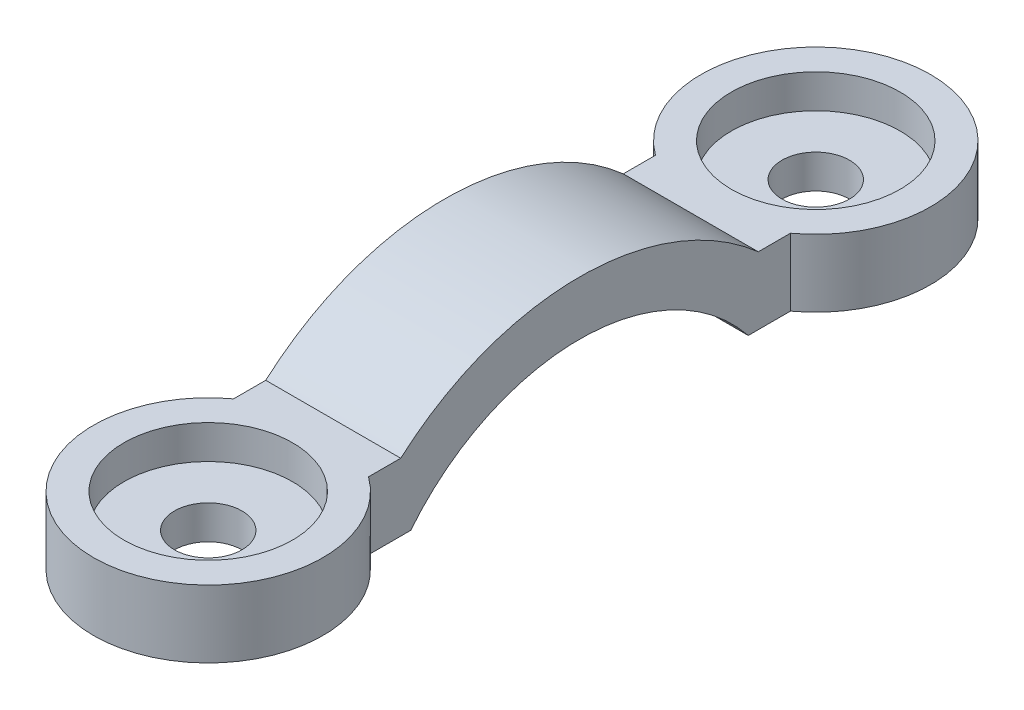
ISO-10303-21;
HEADER;
FILE_DESCRIPTION(('STEP AP214'),'2;1');
FILE_NAME('part.step','',(''),(''),'','','');
FILE_SCHEMA(('AUTOMOTIVE_DESIGN { 1 0 10303 214 1 1 1 1 }'));
ENDSEC;
DATA;
#1=APPLICATION_CONTEXT('core data for automotive mechanical design processes');
#2=APPLICATION_PROTOCOL_DEFINITION('international standard','automotive_design',2000,#1);
#3=PRODUCT_CONTEXT('',#1,'mechanical');
#4=PRODUCT('Part','Part','',(#3));
#5=PRODUCT_RELATED_PRODUCT_CATEGORY('part','',(#4));
#6=PRODUCT_DEFINITION_FORMATION('','',#4);
#7=PRODUCT_DEFINITION_CONTEXT('part definition',#1,'design');
#8=PRODUCT_DEFINITION('design','',#6,#7);
#9=PRODUCT_DEFINITION_SHAPE('','',#8);
#10=(LENGTH_UNIT() NAMED_UNIT(*) SI_UNIT(.MILLI.,.METRE.));
#11=(NAMED_UNIT(*) PLANE_ANGLE_UNIT() SI_UNIT($,.RADIAN.));
#12=(NAMED_UNIT(*) SI_UNIT($,.STERADIAN.) SOLID_ANGLE_UNIT());
#13=UNCERTAINTY_MEASURE_WITH_UNIT(LENGTH_MEASURE(1.E-05),#10,'distance_accuracy_value','');
#14=(GEOMETRIC_REPRESENTATION_CONTEXT(3) GLOBAL_UNCERTAINTY_ASSIGNED_CONTEXT((#13)) GLOBAL_UNIT_ASSIGNED_CONTEXT((#10,
#11,#12)) REPRESENTATION_CONTEXT('',''));
#15=CARTESIAN_POINT('',(0.,0.,0.));
#16=DIRECTION('',(0.,0.,1.));
#17=DIRECTION('',(1.,0.,0.));
#18=AXIS2_PLACEMENT_3D('',#15,#16,#17);
#19=CARTESIAN_POINT('',(5.,20.01,22.5028036855739));
#20=DIRECTION('',(0.,-1.,0.));
#21=DIRECTION('',(0.,0.,-1.));
#22=AXIS2_PLACEMENT_3D('',#19,#20,#21);
#23=CYLINDRICAL_SURFACE('',#22,2.5);
#24=CARTESIAN_POINT('',(5.,10.,22.5028036855739));
#25=DIRECTION('',(0.,-1.,0.));
#26=DIRECTION('',(0.,0.,-1.));
#27=AXIS2_PLACEMENT_3D('',#24,#25,#26);
#28=CIRCLE('',#27,2.5);
#29=CARTESIAN_POINT('',(5.,10.,20.0028036855739));
#30=VERTEX_POINT('',#29);
#31=EDGE_CURVE('E170',#30,#30,#28,.T.);
#32=ORIENTED_EDGE('',*,*,#31,.T.);
#33=EDGE_LOOP('',(#32));
#34=FACE_BOUND('',#33,.T.);
#35=CARTESIAN_POINT('',(5.,12.5,22.5028036855739));
#36=DIRECTION('',(0.,1.,0.));
#37=DIRECTION('',(0.,0.,1.));
#38=AXIS2_PLACEMENT_3D('',#35,#36,#37);
#39=CIRCLE('',#38,2.5);
#40=CARTESIAN_POINT('',(5.,12.5,25.0028036855739));
#41=VERTEX_POINT('',#40);
#42=EDGE_CURVE('E39',#41,#41,#39,.F.);
#43=ORIENTED_EDGE('',*,*,#42,.F.);
#44=EDGE_LOOP('',(#43));
#45=FACE_BOUND('',#44,.T.);
#46=ADVANCED_FACE('F35',(#34,#45),#23,.F.);
#47=CARTESIAN_POINT('',(5.,20.01,-22.5028036855739));
#48=DIRECTION('',(0.,-1.,0.));
#49=DIRECTION('',(0.,0.,-1.));
#50=AXIS2_PLACEMENT_3D('',#47,#48,#49);
#51=CYLINDRICAL_SURFACE('',#50,2.5);
#52=CARTESIAN_POINT('',(5.,10.,-22.5028036855739));
#53=DIRECTION('',(0.,-1.,0.));
#54=DIRECTION('',(0.,0.,1.));
#55=AXIS2_PLACEMENT_3D('',#52,#53,#54);
#56=CIRCLE('',#55,2.5);
#57=CARTESIAN_POINT('',(5.,10.,-20.0028036855739));
#58=VERTEX_POINT('',#57);
#59=EDGE_CURVE('E167',#58,#58,#56,.T.);
#60=ORIENTED_EDGE('',*,*,#59,.T.);
#61=EDGE_LOOP('',(#60));
#62=FACE_BOUND('',#61,.T.);
#63=CARTESIAN_POINT('',(5.,12.5,-22.5028036855739));
#64=DIRECTION('',(0.,1.,0.));
#65=DIRECTION('',(0.,0.,1.));
#66=AXIS2_PLACEMENT_3D('',#63,#64,#65);
#67=CIRCLE('',#66,2.5);
#68=CARTESIAN_POINT('',(5.,12.5,-20.0028036855739));
#69=VERTEX_POINT('',#68);
#70=EDGE_CURVE('E142',#69,#69,#67,.F.);
#71=ORIENTED_EDGE('',*,*,#70,.F.);
#72=EDGE_LOOP('',(#71));
#73=FACE_BOUND('',#72,.T.);
#74=ADVANCED_FACE('F219',(#62,#73),#51,.F.);
#75=CARTESIAN_POINT('',(10.,15.,0.));
#76=DIRECTION('',(0.,-1.,0.));
#77=DIRECTION('',(0.,0.,-1.));
#78=AXIS2_PLACEMENT_3D('',#75,#76,#77);
#79=PLANE('',#78);
#80=CARTESIAN_POINT('',(5.,15.,-22.5028036855739));
#81=DIRECTION('',(0.,1.,0.));
#82=DIRECTION('',(0.,0.,1.));
#83=AXIS2_PLACEMENT_3D('',#80,#81,#82);
#84=CIRCLE('',#83,6.25);
#85=CARTESIAN_POINT('',(5.,15.,-16.2528036855739));
#86=VERTEX_POINT('',#85);
#87=EDGE_CURVE('E152',#86,#86,#84,.T.);
#88=ORIENTED_EDGE('',*,*,#87,.F.);
#89=EDGE_LOOP('',(#88));
#90=FACE_BOUND('',#89,.T.);
#91=DIRECTION('',(0.,0.,1.));
#92=VECTOR('',#91,1.);
#93=CARTESIAN_POINT('',(10.,15.,0.));
#94=LINE('',#93,#92);
#95=CARTESIAN_POINT('',(10.,15.,-15.6289401431401));
#96=VERTEX_POINT('',#95);
#97=CARTESIAN_POINT('',(10.,15.,-13.2438702802466));
#98=VERTEX_POINT('',#97);
#99=EDGE_CURVE('E125',#96,#98,#94,.T.);
#100=ORIENTED_EDGE('',*,*,#99,.F.);
#101=CARTESIAN_POINT('',(5.,15.,-22.5028036855739));
#102=DIRECTION('',(0.,1.,0.));
#103=DIRECTION('',(0.,0.,1.));
#104=AXIS2_PLACEMENT_3D('',#101,#102,#103);
#105=CIRCLE('',#104,8.5);
#106=CARTESIAN_POINT('',(0.,15.,-15.6289401431401));
#107=VERTEX_POINT('',#106);
#108=EDGE_CURVE('E109',#96,#107,#105,.T.);
#109=ORIENTED_EDGE('',*,*,#108,.T.);
#110=DIRECTION('',(0.,0.,1.));
#111=VECTOR('',#110,1.);
#112=CARTESIAN_POINT('',(0.,15.,0.));
#113=LINE('',#112,#111);
#114=CARTESIAN_POINT('',(0.,15.,-13.2438702802466));
#115=VERTEX_POINT('',#114);
#116=EDGE_CURVE('E119',#107,#115,#113,.T.);
#117=ORIENTED_EDGE('',*,*,#116,.T.);
#118=DIRECTION('',(-1.,0.,0.));
#119=VECTOR('',#118,1.);
#120=CARTESIAN_POINT('',(10.,15.,-13.2438702802466));
#121=LINE('',#120,#119);
#122=EDGE_CURVE('E120',#98,#115,#121,.T.);
#123=ORIENTED_EDGE('',*,*,#122,.F.);
#124=EDGE_LOOP('',(#100,#109,#117,#123));
#125=FACE_BOUND('',#124,.T.);
#126=ADVANCED_FACE('F37',(#90,#125),#79,.F.);
#127=CARTESIAN_POINT('',(10.,0.,0.));
#128=DIRECTION('',(-1.,0.,0.));
#129=DIRECTION('',(0.,0.,1.));
#130=AXIS2_PLACEMENT_3D('',#127,#128,#129);
#131=CYLINDRICAL_SURFACE('',#130,20.01);
#132=CARTESIAN_POINT('',(0.,0.,0.));
#133=DIRECTION('',(1.,0.,0.));
#134=DIRECTION('',(0.,0.,-1.));
#135=AXIS2_PLACEMENT_3D('',#132,#133,#134);
#136=CIRCLE('',#135,20.01);
#137=CARTESIAN_POINT('',(0.,15.,13.2438702802466));
#138=VERTEX_POINT('',#137);
#139=EDGE_CURVE('E182',#115,#138,#136,.T.);
#140=ORIENTED_EDGE('',*,*,#139,.T.);
#141=DIRECTION('',(-1.,0.,0.));
#142=VECTOR('',#141,1.);
#143=CARTESIAN_POINT('',(10.,15.,13.2438702802466));
#144=LINE('',#143,#142);
#145=CARTESIAN_POINT('',(10.,15.,13.2438702802466));
#146=VERTEX_POINT('',#145);
#147=EDGE_CURVE('E138',#146,#138,#144,.T.);
#148=ORIENTED_EDGE('',*,*,#147,.F.);
#149=CARTESIAN_POINT('',(10.,0.,0.));
#150=DIRECTION('',(1.,0.,0.));
#151=DIRECTION('',(0.,0.,-1.));
#152=AXIS2_PLACEMENT_3D('',#149,#150,#151);
#153=CIRCLE('',#152,20.01);
#154=EDGE_CURVE('E128',#98,#146,#153,.T.);
#155=ORIENTED_EDGE('',*,*,#154,.F.);
#156=ORIENTED_EDGE('',*,*,#122,.T.);
#157=EDGE_LOOP('',(#140,#148,#155,#156));
#158=FACE_BOUND('',#157,.T.);
#159=ADVANCED_FACE('F205',(#158),#131,.T.);
#160=CARTESIAN_POINT('',(10.,15.,0.));
#161=DIRECTION('',(0.,1.,0.));
#162=DIRECTION('',(0.,0.,1.));
#163=AXIS2_PLACEMENT_3D('',#160,#161,#162);
#164=PLANE('',#163);
#165=CARTESIAN_POINT('',(5.,15.,22.5028036855739));
#166=DIRECTION('',(0.,1.,0.));
#167=DIRECTION('',(0.,0.,1.));
#168=AXIS2_PLACEMENT_3D('',#165,#166,#167);
#169=CIRCLE('',#168,6.25);
#170=CARTESIAN_POINT('',(5.,15.,28.7528036855739));
#171=VERTEX_POINT('',#170);
#172=EDGE_CURVE('E159',#171,#171,#169,.T.);
#173=ORIENTED_EDGE('',*,*,#172,.F.);
#174=EDGE_LOOP('',(#173));
#175=FACE_BOUND('',#174,.T.);
#176=DIRECTION('',(0.,0.,-1.));
#177=VECTOR('',#176,1.);
#178=CARTESIAN_POINT('',(0.,15.,0.));
#179=LINE('',#178,#177);
#180=CARTESIAN_POINT('',(0.,15.,15.6289401431401));
#181=VERTEX_POINT('',#180);
#182=EDGE_CURVE('E185',#181,#138,#179,.T.);
#183=ORIENTED_EDGE('',*,*,#182,.F.);
#184=CARTESIAN_POINT('',(5.,15.,22.5028036855739));
#185=DIRECTION('',(0.,1.,0.));
#186=DIRECTION('',(0.,0.,1.));
#187=AXIS2_PLACEMENT_3D('',#184,#185,#186);
#188=CIRCLE('',#187,8.5);
#189=CARTESIAN_POINT('',(10.,15.,15.6289401431401));
#190=VERTEX_POINT('',#189);
#191=EDGE_CURVE('E144',#181,#190,#188,.T.);
#192=ORIENTED_EDGE('',*,*,#191,.T.);
#193=DIRECTION('',(0.,0.,-1.));
#194=VECTOR('',#193,1.);
#195=CARTESIAN_POINT('',(10.,15.,0.));
#196=LINE('',#195,#194);
#197=EDGE_CURVE('E57',#190,#146,#196,.T.);
#198=ORIENTED_EDGE('',*,*,#197,.T.);
#199=ORIENTED_EDGE('',*,*,#147,.T.);
#200=EDGE_LOOP('',(#183,#192,#198,#199));
#201=FACE_BOUND('',#200,.T.);
#202=ADVANCED_FACE('F208',(#175,#201),#164,.T.);
#203=CARTESIAN_POINT('',(10.,10.,0.));
#204=DIRECTION('',(0.,-1.,0.));
#205=DIRECTION('',(0.,0.,-1.));
#206=AXIS2_PLACEMENT_3D('',#203,#204,#205);
#207=PLANE('',#206);
#208=DIRECTION('',(0.,0.,1.));
#209=VECTOR('',#208,1.);
#210=CARTESIAN_POINT('',(10.,10.,0.));
#211=LINE('',#210,#209);
#212=CARTESIAN_POINT('',(10.,10.,12.5028036855739));
#213=VERTEX_POINT('',#212);
#214=CARTESIAN_POINT('',(10.,10.,15.6289401431401));
#215=VERTEX_POINT('',#214);
#216=EDGE_CURVE('E175',#213,#215,#211,.T.);
#217=ORIENTED_EDGE('',*,*,#216,.T.);
#218=CARTESIAN_POINT('',(5.,10.,22.5028036855739));
#219=DIRECTION('',(0.,1.,0.));
#220=DIRECTION('',(0.,0.,1.));
#221=AXIS2_PLACEMENT_3D('',#218,#219,#220);
#222=CIRCLE('',#221,8.5);
#223=CARTESIAN_POINT('',(0.,10.,15.6289401431401));
#224=VERTEX_POINT('',#223);
#225=EDGE_CURVE('E149',#215,#224,#222,.F.);
#226=ORIENTED_EDGE('',*,*,#225,.T.);
#227=DIRECTION('',(0.,0.,1.));
#228=VECTOR('',#227,1.);
#229=CARTESIAN_POINT('',(0.,10.,0.));
#230=LINE('',#229,#228);
#231=CARTESIAN_POINT('',(0.,10.,12.5028036855739));
#232=VERTEX_POINT('',#231);
#233=EDGE_CURVE('E130',#232,#224,#230,.T.);
#234=ORIENTED_EDGE('',*,*,#233,.F.);
#235=DIRECTION('',(-1.,0.,0.));
#236=VECTOR('',#235,1.);
#237=CARTESIAN_POINT('',(10.,10.,12.5028036855739));
#238=LINE('',#237,#236);
#239=EDGE_CURVE('E135',#213,#232,#238,.T.);
#240=ORIENTED_EDGE('',*,*,#239,.F.);
#241=EDGE_LOOP('',(#217,#226,#234,#240));
#242=FACE_BOUND('',#241,.T.);
#243=ORIENTED_EDGE('',*,*,#31,.F.);
#244=EDGE_LOOP('',(#243));
#245=FACE_BOUND('',#244,.T.);
#246=ADVANCED_FACE('F194',(#242,#245),#207,.T.);
#247=CARTESIAN_POINT('',(10.,0.,0.));
#248=DIRECTION('',(-1.,0.,0.));
#249=DIRECTION('',(0.,0.,1.));
#250=AXIS2_PLACEMENT_3D('',#247,#248,#249);
#251=CYLINDRICAL_SURFACE('',#250,16.01);
#252=CARTESIAN_POINT('',(0.,0.,0.));
#253=DIRECTION('',(1.,0.,0.));
#254=DIRECTION('',(0.,0.,-1.));
#255=AXIS2_PLACEMENT_3D('',#252,#253,#254);
#256=CIRCLE('',#255,16.01);
#257=CARTESIAN_POINT('',(0.,10.,-12.5028036855739));
#258=VERTEX_POINT('',#257);
#259=EDGE_CURVE('E126',#258,#232,#256,.T.);
#260=ORIENTED_EDGE('',*,*,#259,.F.);
#261=DIRECTION('',(-1.,0.,0.));
#262=VECTOR('',#261,1.);
#263=CARTESIAN_POINT('',(10.,10.,-12.5028036855739));
#264=LINE('',#263,#262);
#265=CARTESIAN_POINT('',(10.,10.,-12.5028036855739));
#266=VERTEX_POINT('',#265);
#267=EDGE_CURVE('E124',#266,#258,#264,.T.);
#268=ORIENTED_EDGE('',*,*,#267,.F.);
#269=CARTESIAN_POINT('',(10.,0.,0.));
#270=DIRECTION('',(1.,0.,0.));
#271=DIRECTION('',(0.,0.,-1.));
#272=AXIS2_PLACEMENT_3D('',#269,#270,#271);
#273=CIRCLE('',#272,16.01);
#274=EDGE_CURVE('E177',#266,#213,#273,.T.);
#275=ORIENTED_EDGE('',*,*,#274,.T.);
#276=ORIENTED_EDGE('',*,*,#239,.T.);
#277=EDGE_LOOP('',(#260,#268,#275,#276));
#278=FACE_BOUND('',#277,.T.);
#279=ADVANCED_FACE('F199',(#278),#251,.F.);
#280=CARTESIAN_POINT('',(10.,10.,0.));
#281=DIRECTION('',(0.,1.,0.));
#282=DIRECTION('',(0.,0.,1.));
#283=AXIS2_PLACEMENT_3D('',#280,#281,#282);
#284=PLANE('',#283);
#285=DIRECTION('',(0.,0.,-1.));
#286=VECTOR('',#285,1.);
#287=CARTESIAN_POINT('',(0.,10.,0.));
#288=LINE('',#287,#286);
#289=CARTESIAN_POINT('',(0.,10.,-15.6289401431401));
#290=VERTEX_POINT('',#289);
#291=EDGE_CURVE('E116',#258,#290,#288,.T.);
#292=ORIENTED_EDGE('',*,*,#291,.T.);
#293=CARTESIAN_POINT('',(5.,10.,-22.5028036855739));
#294=DIRECTION('',(0.,1.,0.));
#295=DIRECTION('',(0.,0.,1.));
#296=AXIS2_PLACEMENT_3D('',#293,#294,#295);
#297=CIRCLE('',#296,8.5);
#298=CARTESIAN_POINT('',(10.,10.,-15.6289401431401));
#299=VERTEX_POINT('',#298);
#300=EDGE_CURVE('E99',#290,#299,#297,.F.);
#301=ORIENTED_EDGE('',*,*,#300,.T.);
#302=DIRECTION('',(0.,0.,-1.));
#303=VECTOR('',#302,1.);
#304=CARTESIAN_POINT('',(10.,10.,0.));
#305=LINE('',#304,#303);
#306=EDGE_CURVE('E136',#266,#299,#305,.T.);
#307=ORIENTED_EDGE('',*,*,#306,.F.);
#308=ORIENTED_EDGE('',*,*,#267,.T.);
#309=EDGE_LOOP('',(#292,#301,#307,#308));
#310=FACE_BOUND('',#309,.T.);
#311=ORIENTED_EDGE('',*,*,#59,.F.);
#312=EDGE_LOOP('',(#311));
#313=FACE_BOUND('',#312,.T.);
#314=ADVANCED_FACE('F122',(#310,#313),#284,.F.);
#315=CARTESIAN_POINT('',(10.,0.,0.));
#316=DIRECTION('',(1.,0.,0.));
#317=DIRECTION('',(0.,0.,-1.));
#318=AXIS2_PLACEMENT_3D('',#315,#316,#317);
#319=PLANE('',#318);
#320=DIRECTION('',(0.,1.,0.));
#321=VECTOR('',#320,1.);
#322=CARTESIAN_POINT('',(10.,-14.0416305603426,15.6289401431401));
#323=LINE('',#322,#321);
#324=EDGE_CURVE('E52',#215,#190,#323,.T.);
#325=ORIENTED_EDGE('',*,*,#324,.F.);
#326=ORIENTED_EDGE('',*,*,#216,.F.);
#327=ORIENTED_EDGE('',*,*,#274,.F.);
#328=ORIENTED_EDGE('',*,*,#306,.T.);
#329=DIRECTION('',(0.,1.,0.));
#330=VECTOR('',#329,1.);
#331=CARTESIAN_POINT('',(10.,-14.0416305603426,-15.6289401431401));
#332=LINE('',#331,#330);
#333=EDGE_CURVE('E104',#96,#299,#332,.F.);
#334=ORIENTED_EDGE('',*,*,#333,.F.);
#335=ORIENTED_EDGE('',*,*,#99,.T.);
#336=ORIENTED_EDGE('',*,*,#154,.T.);
#337=ORIENTED_EDGE('',*,*,#197,.F.);
#338=EDGE_LOOP('',(#325,#326,#327,#328,#334,#335,#336,#337));
#339=FACE_BOUND('',#338,.T.);
#340=ADVANCED_FACE('F197',(#339),#319,.T.);
#341=CARTESIAN_POINT('',(0.,0.,0.));
#342=DIRECTION('',(1.,0.,0.));
#343=DIRECTION('',(0.,0.,-1.));
#344=AXIS2_PLACEMENT_3D('',#341,#342,#343);
#345=PLANE('',#344);
#346=ORIENTED_EDGE('',*,*,#233,.T.);
#347=DIRECTION('',(0.,1.,0.));
#348=VECTOR('',#347,1.);
#349=CARTESIAN_POINT('',(0.,-14.0416305603426,15.6289401431401));
#350=LINE('',#349,#348);
#351=EDGE_CURVE('E11',#224,#181,#350,.T.);
#352=ORIENTED_EDGE('',*,*,#351,.T.);
#353=ORIENTED_EDGE('',*,*,#182,.T.);
#354=ORIENTED_EDGE('',*,*,#139,.F.);
#355=ORIENTED_EDGE('',*,*,#116,.F.);
#356=DIRECTION('',(0.,1.,0.));
#357=VECTOR('',#356,1.);
#358=CARTESIAN_POINT('',(0.,-14.0416305603426,-15.6289401431401));
#359=LINE('',#358,#357);
#360=EDGE_CURVE('E44',#107,#290,#359,.F.);
#361=ORIENTED_EDGE('',*,*,#360,.T.);
#362=ORIENTED_EDGE('',*,*,#291,.F.);
#363=ORIENTED_EDGE('',*,*,#259,.T.);
#364=EDGE_LOOP('',(#346,#352,#353,#354,#355,#361,#362,#363));
#365=FACE_BOUND('',#364,.T.);
#366=ADVANCED_FACE('F114',(#365),#345,.F.);
#367=CARTESIAN_POINT('',(5.,-14.0416305603426,-22.5028036855739));
#368=DIRECTION('',(0.,1.,0.));
#369=DIRECTION('',(0.,0.,1.));
#370=AXIS2_PLACEMENT_3D('',#367,#368,#369);
#371=CYLINDRICAL_SURFACE('',#370,8.5);
#372=ORIENTED_EDGE('',*,*,#108,.F.);
#373=ORIENTED_EDGE('',*,*,#333,.T.);
#374=ORIENTED_EDGE('',*,*,#300,.F.);
#375=ORIENTED_EDGE('',*,*,#360,.F.);
#376=EDGE_LOOP('',(#372,#373,#374,#375));
#377=FACE_BOUND('',#376,.T.);
#378=ADVANCED_FACE('F101',(#377),#371,.T.);
#379=CARTESIAN_POINT('',(5.,-14.0416305603426,22.5028036855739));
#380=DIRECTION('',(0.,1.,0.));
#381=DIRECTION('',(0.,0.,1.));
#382=AXIS2_PLACEMENT_3D('',#379,#380,#381);
#383=CYLINDRICAL_SURFACE('',#382,8.5);
#384=ORIENTED_EDGE('',*,*,#225,.F.);
#385=ORIENTED_EDGE('',*,*,#324,.T.);
#386=ORIENTED_EDGE('',*,*,#191,.F.);
#387=ORIENTED_EDGE('',*,*,#351,.F.);
#388=EDGE_LOOP('',(#384,#385,#386,#387));
#389=FACE_BOUND('',#388,.T.);
#390=ADVANCED_FACE('F193',(#389),#383,.T.);
#391=CARTESIAN_POINT('',(5.,12.5,-22.5028036855739));
#392=DIRECTION('',(0.,1.,0.));
#393=DIRECTION('',(0.,0.,1.));
#394=AXIS2_PLACEMENT_3D('',#391,#392,#393);
#395=PLANE('',#394);
#396=CARTESIAN_POINT('',(5.,12.5,-22.5028036855739));
#397=DIRECTION('',(0.,1.,0.));
#398=DIRECTION('',(0.,0.,1.));
#399=AXIS2_PLACEMENT_3D('',#396,#397,#398);
#400=CIRCLE('',#399,6.25);
#401=CARTESIAN_POINT('',(5.,12.5,-16.2528036855739));
#402=VERTEX_POINT('',#401);
#403=EDGE_CURVE('E145',#402,#402,#400,.T.);
#404=ORIENTED_EDGE('',*,*,#403,.T.);
#405=EDGE_LOOP('',(#404));
#406=FACE_BOUND('',#405,.T.);
#407=ORIENTED_EDGE('',*,*,#70,.T.);
#408=EDGE_LOOP('',(#407));
#409=FACE_BOUND('',#408,.T.);
#410=ADVANCED_FACE('F265',(#406,#409),#395,.T.);
#411=CARTESIAN_POINT('',(5.,12.5,-22.5028036855739));
#412=DIRECTION('',(0.,1.,0.));
#413=DIRECTION('',(0.,0.,1.));
#414=AXIS2_PLACEMENT_3D('',#411,#412,#413);
#415=CYLINDRICAL_SURFACE('',#414,6.25);
#416=ORIENTED_EDGE('',*,*,#403,.F.);
#417=EDGE_LOOP('',(#416));
#418=FACE_BOUND('',#417,.T.);
#419=ORIENTED_EDGE('',*,*,#87,.T.);
#420=EDGE_LOOP('',(#419));
#421=FACE_BOUND('',#420,.T.);
#422=ADVANCED_FACE('F272',(#418,#421),#415,.F.);
#423=CARTESIAN_POINT('',(5.,12.5,22.5028036855739));
#424=DIRECTION('',(0.,1.,0.));
#425=DIRECTION('',(0.,0.,1.));
#426=AXIS2_PLACEMENT_3D('',#423,#424,#425);
#427=PLANE('',#426);
#428=CARTESIAN_POINT('',(5.,12.5,22.5028036855739));
#429=DIRECTION('',(0.,1.,0.));
#430=DIRECTION('',(0.,0.,1.));
#431=AXIS2_PLACEMENT_3D('',#428,#429,#430);
#432=CIRCLE('',#431,6.25);
#433=CARTESIAN_POINT('',(5.,12.5,28.7528036855739));
#434=VERTEX_POINT('',#433);
#435=EDGE_CURVE('E381',#434,#434,#432,.T.);
#436=ORIENTED_EDGE('',*,*,#435,.T.);
#437=EDGE_LOOP('',(#436));
#438=FACE_BOUND('',#437,.T.);
#439=ORIENTED_EDGE('',*,*,#42,.T.);
#440=EDGE_LOOP('',(#439));
#441=FACE_BOUND('',#440,.T.);
#442=ADVANCED_FACE('F279',(#438,#441),#427,.T.);
#443=CARTESIAN_POINT('',(5.,12.5,22.5028036855739));
#444=DIRECTION('',(0.,1.,0.));
#445=DIRECTION('',(0.,0.,1.));
#446=AXIS2_PLACEMENT_3D('',#443,#444,#445);
#447=CYLINDRICAL_SURFACE('',#446,6.25);
#448=ORIENTED_EDGE('',*,*,#435,.F.);
#449=EDGE_LOOP('',(#448));
#450=FACE_BOUND('',#449,.T.);
#451=ORIENTED_EDGE('',*,*,#172,.T.);
#452=EDGE_LOOP('',(#451));
#453=FACE_BOUND('',#452,.T.);
#454=ADVANCED_FACE('F287',(#450,#453),#447,.F.);
#455=CLOSED_SHELL('',(#46,#74,#126,#159,#202,#246,#279,#314,#340,#366,#378,#390,#410,#422,#442,#454));
#456=MANIFOLD_SOLID_BREP('B2',#455);
#457=ADVANCED_BREP_SHAPE_REPRESENTATION('',(#18,#456),#14);
#458=SHAPE_DEFINITION_REPRESENTATION(#9,#457);
ENDSEC;
END-ISO-10303-21;
